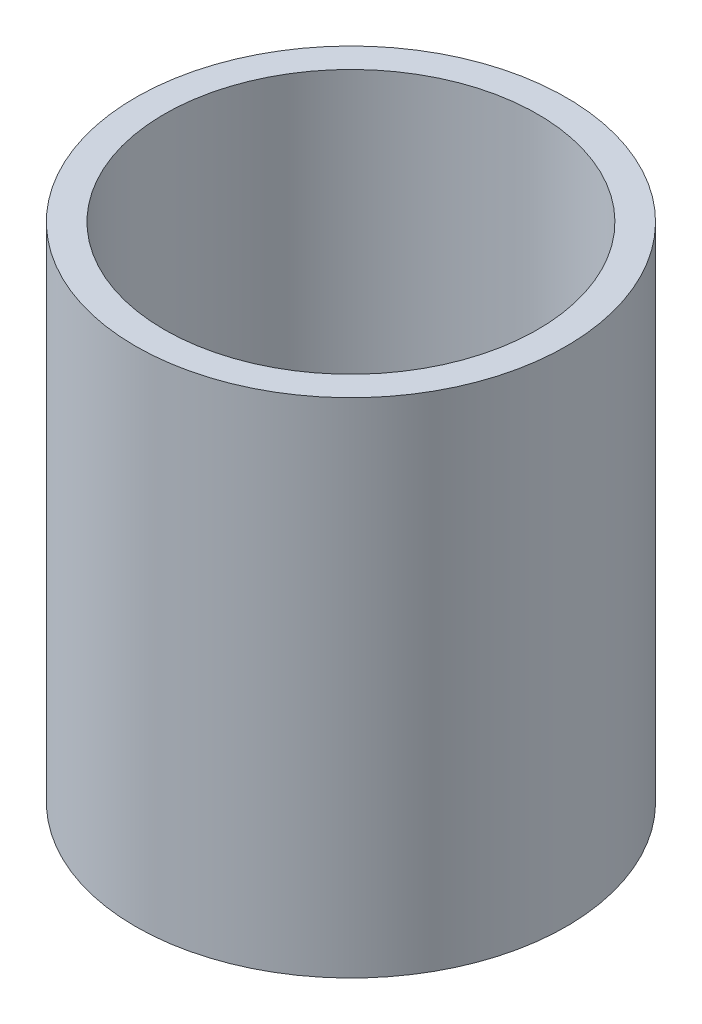
ISO-10303-21;
HEADER;
FILE_DESCRIPTION(('STEP AP214'),'2;1');
FILE_NAME('part.step','',(''),(''),'','','');
FILE_SCHEMA(('AUTOMOTIVE_DESIGN { 1 0 10303 214 1 1 1 1 }'));
ENDSEC;
DATA;
#1=APPLICATION_CONTEXT('core data for automotive mechanical design processes');
#2=APPLICATION_PROTOCOL_DEFINITION('international standard','automotive_design',2000,#1);
#3=PRODUCT_CONTEXT('',#1,'mechanical');
#4=PRODUCT('Part','Part','',(#3));
#5=PRODUCT_RELATED_PRODUCT_CATEGORY('part','',(#4));
#6=PRODUCT_DEFINITION_FORMATION('','',#4);
#7=PRODUCT_DEFINITION_CONTEXT('part definition',#1,'design');
#8=PRODUCT_DEFINITION('design','',#6,#7);
#9=PRODUCT_DEFINITION_SHAPE('','',#8);
#10=(LENGTH_UNIT() NAMED_UNIT(*) SI_UNIT(.MILLI.,.METRE.));
#11=(NAMED_UNIT(*) PLANE_ANGLE_UNIT() SI_UNIT($,.RADIAN.));
#12=(NAMED_UNIT(*) SI_UNIT($,.STERADIAN.) SOLID_ANGLE_UNIT());
#13=UNCERTAINTY_MEASURE_WITH_UNIT(LENGTH_MEASURE(1.E-05),#10,'distance_accuracy_value','');
#14=(GEOMETRIC_REPRESENTATION_CONTEXT(3) GLOBAL_UNCERTAINTY_ASSIGNED_CONTEXT((#13)) GLOBAL_UNIT_ASSIGNED_CONTEXT((#10,
#11,#12)) REPRESENTATION_CONTEXT('',''));
#15=CARTESIAN_POINT('',(0.,0.,0.));
#16=DIRECTION('',(0.,0.,1.));
#17=DIRECTION('',(1.,0.,0.));
#18=AXIS2_PLACEMENT_3D('',#15,#16,#17);
#19=CARTESIAN_POINT('',(-13.9305799216071,35.,-15.3576149379669));
#20=DIRECTION('',(0.,-1.,0.));
#21=DIRECTION('',(0.,0.,-1.));
#22=AXIS2_PLACEMENT_3D('',#19,#20,#21);
#23=CYLINDRICAL_SURFACE('',#22,15.);
#24=CARTESIAN_POINT('',(-13.9305799216071,35.,-15.3576149379669));
#25=DIRECTION('',(0.,1.,0.));
#26=DIRECTION('',(0.,0.,1.));
#27=AXIS2_PLACEMENT_3D('',#24,#25,#26);
#28=CIRCLE('',#27,15.);
#29=CARTESIAN_POINT('',(-13.9305799216071,35.,-0.35761493796687));
#30=VERTEX_POINT('',#29);
#31=EDGE_CURVE('E10',#30,#30,#28,.T.);
#32=ORIENTED_EDGE('',*,*,#31,.F.);
#33=EDGE_LOOP('',(#32));
#34=FACE_BOUND('',#33,.T.);
#35=CARTESIAN_POINT('',(-13.9305799216071,0.,-15.3576149379669));
#36=DIRECTION('',(0.,1.,0.));
#37=DIRECTION('',(0.,0.,1.));
#38=AXIS2_PLACEMENT_3D('',#35,#36,#37);
#39=CIRCLE('',#38,15.);
#40=CARTESIAN_POINT('',(-13.9305799216071,0.,-0.35761493796687));
#41=VERTEX_POINT('',#40);
#42=EDGE_CURVE('E40',#41,#41,#39,.T.);
#43=ORIENTED_EDGE('',*,*,#42,.T.);
#44=EDGE_LOOP('',(#43));
#45=FACE_BOUND('',#44,.T.);
#46=ADVANCED_FACE('F37',(#34,#45),#23,.T.);
#47=CARTESIAN_POINT('',(-13.9305799216071,35.,-15.3576149379669));
#48=DIRECTION('',(0.,1.,0.));
#49=DIRECTION('',(0.,0.,1.));
#50=AXIS2_PLACEMENT_3D('',#47,#48,#49);
#51=PLANE('',#50);
#52=CARTESIAN_POINT('',(-13.9305799216071,35.,-15.3576149379669));
#53=DIRECTION('',(0.,1.,0.));
#54=DIRECTION('',(0.,0.,1.));
#55=AXIS2_PLACEMENT_3D('',#52,#53,#54);
#56=CIRCLE('',#55,13.);
#57=CARTESIAN_POINT('',(-13.9305799216071,35.,-2.35761493796687));
#58=VERTEX_POINT('',#57);
#59=EDGE_CURVE('E49',#58,#58,#56,.T.);
#60=ORIENTED_EDGE('',*,*,#59,.F.);
#61=EDGE_LOOP('',(#60));
#62=FACE_BOUND('',#61,.T.);
#63=ORIENTED_EDGE('',*,*,#31,.T.);
#64=EDGE_LOOP('',(#63));
#65=FACE_BOUND('',#64,.T.);
#66=ADVANCED_FACE('F80',(#62,#65),#51,.T.);
#67=CARTESIAN_POINT('',(-13.9305799216071,0.,-15.3576149379669));
#68=DIRECTION('',(0.,1.,0.));
#69=DIRECTION('',(0.,0.,1.));
#70=AXIS2_PLACEMENT_3D('',#67,#68,#69);
#71=PLANE('',#70);
#72=CARTESIAN_POINT('',(-13.8502926436908,0.,-15.4579740353624));
#73=DIRECTION('',(0.,-1.,0.));
#74=DIRECTION('',(0.,0.,-1.));
#75=AXIS2_PLACEMENT_3D('',#72,#73,#74);
#76=CIRCLE('',#75,3.);
#77=CARTESIAN_POINT('',(-13.8502926436908,0.,-18.4579740353624));
#78=VERTEX_POINT('',#77);
#79=EDGE_CURVE('E58',#78,#78,#76,.T.);
#80=ORIENTED_EDGE('',*,*,#79,.F.);
#81=EDGE_LOOP('',(#80));
#82=FACE_BOUND('',#81,.T.);
#83=ORIENTED_EDGE('',*,*,#42,.F.);
#84=EDGE_LOOP('',(#83));
#85=FACE_BOUND('',#84,.T.);
#86=ADVANCED_FACE('F76',(#82,#85),#71,.F.);
#87=CARTESIAN_POINT('',(-13.9305799216071,35.,-15.3576149379669));
#88=DIRECTION('',(0.,-1.,0.));
#89=DIRECTION('',(0.,0.,-1.));
#90=AXIS2_PLACEMENT_3D('',#87,#88,#89);
#91=CYLINDRICAL_SURFACE('',#90,13.);
#92=ORIENTED_EDGE('',*,*,#59,.T.);
#93=EDGE_LOOP('',(#92));
#94=FACE_BOUND('',#93,.T.);
#95=CARTESIAN_POINT('',(-13.9305799216071,2.,-15.3576149379669));
#96=DIRECTION('',(0.,1.,0.));
#97=DIRECTION('',(0.,0.,1.));
#98=AXIS2_PLACEMENT_3D('',#95,#96,#97);
#99=CIRCLE('',#98,13.);
#100=CARTESIAN_POINT('',(-13.9305799216071,2.,-2.35761493796687));
#101=VERTEX_POINT('',#100);
#102=EDGE_CURVE('E54',#101,#101,#99,.T.);
#103=ORIENTED_EDGE('',*,*,#102,.F.);
#104=EDGE_LOOP('',(#103));
#105=FACE_BOUND('',#104,.T.);
#106=ADVANCED_FACE('F79',(#94,#105),#91,.F.);
#107=CARTESIAN_POINT('',(-13.9305799216071,2.,-15.3576149379669));
#108=DIRECTION('',(0.,1.,0.));
#109=DIRECTION('',(0.,0.,1.));
#110=AXIS2_PLACEMENT_3D('',#107,#108,#109);
#111=PLANE('',#110);
#112=CARTESIAN_POINT('',(-13.8502926436908,2.,-15.4579740353624));
#113=DIRECTION('',(0.,-1.,0.));
#114=DIRECTION('',(0.,0.,-1.));
#115=AXIS2_PLACEMENT_3D('',#112,#113,#114);
#116=CIRCLE('',#115,3.);
#117=CARTESIAN_POINT('',(-13.8502926436908,2.,-18.4579740353624));
#118=VERTEX_POINT('',#117);
#119=EDGE_CURVE('E62',#118,#118,#116,.T.);
#120=ORIENTED_EDGE('',*,*,#119,.T.);
#121=EDGE_LOOP('',(#120));
#122=FACE_BOUND('',#121,.T.);
#123=ORIENTED_EDGE('',*,*,#102,.T.);
#124=EDGE_LOOP('',(#123));
#125=FACE_BOUND('',#124,.T.);
#126=ADVANCED_FACE('F67',(#122,#125),#111,.T.);
#127=CARTESIAN_POINT('',(-13.8502926436908,0.,-15.4579740353624));
#128=DIRECTION('',(0.,-1.,0.));
#129=DIRECTION('',(0.,0.,-1.));
#130=AXIS2_PLACEMENT_3D('',#127,#128,#129);
#131=CYLINDRICAL_SURFACE('',#130,3.);
#132=ORIENTED_EDGE('',*,*,#119,.F.);
#133=EDGE_LOOP('',(#132));
#134=FACE_BOUND('',#133,.T.);
#135=ORIENTED_EDGE('',*,*,#79,.T.);
#136=EDGE_LOOP('',(#135));
#137=FACE_BOUND('',#136,.T.);
#138=ADVANCED_FACE('F70',(#134,#137),#131,.F.);
#139=CLOSED_SHELL('',(#46,#66,#86,#106,#126,#138));
#140=MANIFOLD_SOLID_BREP('B2',#139);
#141=ADVANCED_BREP_SHAPE_REPRESENTATION('',(#18,#140),#14);
#142=SHAPE_DEFINITION_REPRESENTATION(#9,#141);
ENDSEC;
END-ISO-10303-21;
